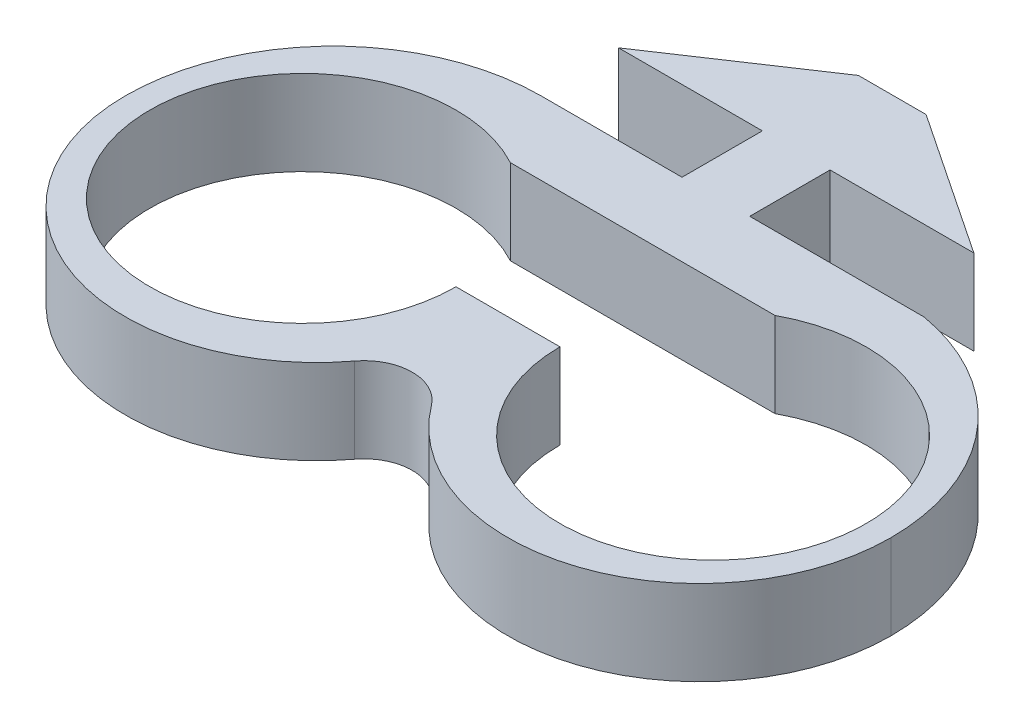
ISO-10303-21;
HEADER;
FILE_DESCRIPTION(('STEP AP214'),'2;1');
FILE_NAME('part.step','',(''),(''),'','','');
FILE_SCHEMA(('AUTOMOTIVE_DESIGN { 1 0 10303 214 1 1 1 1 }'));
ENDSEC;
DATA;
#1=APPLICATION_CONTEXT('core data for automotive mechanical design processes');
#2=APPLICATION_PROTOCOL_DEFINITION('international standard','automotive_design',2000,#1);
#3=PRODUCT_CONTEXT('',#1,'mechanical');
#4=PRODUCT('Part','Part','',(#3));
#5=PRODUCT_RELATED_PRODUCT_CATEGORY('part','',(#4));
#6=PRODUCT_DEFINITION_FORMATION('','',#4);
#7=PRODUCT_DEFINITION_CONTEXT('part definition',#1,'design');
#8=PRODUCT_DEFINITION('design','',#6,#7);
#9=PRODUCT_DEFINITION_SHAPE('','',#8);
#10=(LENGTH_UNIT() NAMED_UNIT(*) SI_UNIT(.MILLI.,.METRE.));
#11=(NAMED_UNIT(*) PLANE_ANGLE_UNIT() SI_UNIT($,.RADIAN.));
#12=(NAMED_UNIT(*) SI_UNIT($,.STERADIAN.) SOLID_ANGLE_UNIT());
#13=UNCERTAINTY_MEASURE_WITH_UNIT(LENGTH_MEASURE(1.E-05),#10,'distance_accuracy_value','');
#14=(GEOMETRIC_REPRESENTATION_CONTEXT(3) GLOBAL_UNCERTAINTY_ASSIGNED_CONTEXT((#13)) GLOBAL_UNIT_ASSIGNED_CONTEXT((#10,
#11,#12)) REPRESENTATION_CONTEXT('',''));
#15=CARTESIAN_POINT('',(0.,0.,0.));
#16=DIRECTION('',(0.,0.,1.));
#17=DIRECTION('',(1.,0.,0.));
#18=AXIS2_PLACEMENT_3D('',#15,#16,#17);
#19=CARTESIAN_POINT('',(0.,4.5,2.125));
#20=DIRECTION('',(0.,0.,1.));
#21=DIRECTION('',(1.,0.,0.));
#22=AXIS2_PLACEMENT_3D('',#19,#20,#21);
#23=PLANE('',#22);
#24=DIRECTION('',(0.,1.,0.));
#25=VECTOR('',#24,1.);
#26=CARTESIAN_POINT('',(-9.2518,-0.00100000000001401,2.125));
#27=LINE('',#26,#25);
#28=CARTESIAN_POINT('',(-9.2518,0.,2.125));
#29=VERTEX_POINT('',#28);
#30=CARTESIAN_POINT('',(-9.2518,4.5,2.125));
#31=VERTEX_POINT('',#30);
#32=EDGE_CURVE('E171',#29,#31,#27,.T.);
#33=ORIENTED_EDGE('',*,*,#32,.T.);
#34=DIRECTION('',(-1.,0.,0.));
#35=VECTOR('',#34,1.);
#36=CARTESIAN_POINT('',(0.,4.5,2.125));
#37=LINE('',#36,#35);
#38=CARTESIAN_POINT('',(-1.7907,4.5,2.125));
#39=VERTEX_POINT('',#38);
#40=EDGE_CURVE('E214',#39,#31,#37,.T.);
#41=ORIENTED_EDGE('',*,*,#40,.F.);
#42=DIRECTION('',(0.,-1.,0.));
#43=VECTOR('',#42,1.);
#44=CARTESIAN_POINT('',(-1.7907,4.5,2.125));
#45=LINE('',#44,#43);
#46=CARTESIAN_POINT('',(-1.7907,0.,2.125));
#47=VERTEX_POINT('',#46);
#48=EDGE_CURVE('E197',#39,#47,#45,.T.);
#49=ORIENTED_EDGE('',*,*,#48,.T.);
#50=DIRECTION('',(-1.,0.,0.));
#51=VECTOR('',#50,1.);
#52=CARTESIAN_POINT('',(0.,0.,2.125));
#53=LINE('',#52,#51);
#54=EDGE_CURVE('E189',#47,#29,#53,.T.);
#55=ORIENTED_EDGE('',*,*,#54,.T.);
#56=EDGE_LOOP('',(#33,#41,#49,#55));
#57=FACE_BOUND('',#56,.T.);
#58=ADVANCED_FACE('F47',(#57),#23,.F.);
#59=CARTESIAN_POINT('',(0.,4.5,2.125));
#60=DIRECTION('',(0.,0.,-1.));
#61=DIRECTION('',(-1.,0.,0.));
#62=AXIS2_PLACEMENT_3D('',#59,#60,#61);
#63=PLANE('',#62);
#64=DIRECTION('',(0.,1.,0.));
#65=VECTOR('',#64,1.);
#66=CARTESIAN_POINT('',(11.02035,-0.00100000000001401,2.125));
#67=LINE('',#66,#65);
#68=CARTESIAN_POINT('',(11.02035,0.,2.125));
#69=VERTEX_POINT('',#68);
#70=CARTESIAN_POINT('',(11.02035,4.5,2.125));
#71=VERTEX_POINT('',#70);
#72=EDGE_CURVE('E195',#69,#71,#67,.T.);
#73=ORIENTED_EDGE('',*,*,#72,.F.);
#74=DIRECTION('',(1.,0.,0.));
#75=VECTOR('',#74,1.);
#76=CARTESIAN_POINT('',(0.,0.,2.125));
#77=LINE('',#76,#75);
#78=CARTESIAN_POINT('',(1.7907,0.,2.125));
#79=VERTEX_POINT('',#78);
#80=EDGE_CURVE('E248',#79,#69,#77,.T.);
#81=ORIENTED_EDGE('',*,*,#80,.F.);
#82=DIRECTION('',(0.,-1.,0.));
#83=VECTOR('',#82,1.);
#84=CARTESIAN_POINT('',(1.7907,4.5,2.125));
#85=LINE('',#84,#83);
#86=CARTESIAN_POINT('',(1.7907,4.5,2.125));
#87=VERTEX_POINT('',#86);
#88=EDGE_CURVE('E56',#87,#79,#85,.T.);
#89=ORIENTED_EDGE('',*,*,#88,.F.);
#90=DIRECTION('',(1.,0.,0.));
#91=VECTOR('',#90,1.);
#92=CARTESIAN_POINT('',(0.,4.5,2.125));
#93=LINE('',#92,#91);
#94=EDGE_CURVE('E199',#87,#71,#93,.T.);
#95=ORIENTED_EDGE('',*,*,#94,.T.);
#96=EDGE_LOOP('',(#73,#81,#89,#95));
#97=FACE_BOUND('',#96,.T.);
#98=ADVANCED_FACE('F49',(#97),#63,.T.);
#99=CARTESIAN_POINT('',(1.7907,4.5,0.));
#100=DIRECTION('',(-1.,0.,0.));
#101=DIRECTION('',(0.,0.,1.));
#102=AXIS2_PLACEMENT_3D('',#99,#100,#101);
#103=PLANE('',#102);
#104=DIRECTION('',(0.,0.,-1.));
#105=VECTOR('',#104,1.);
#106=CARTESIAN_POINT('',(1.7907,0.,0.));
#107=LINE('',#106,#105);
#108=CARTESIAN_POINT('',(1.7907,0.,-2.125));
#109=VERTEX_POINT('',#108);
#110=EDGE_CURVE('E241',#79,#109,#107,.T.);
#111=ORIENTED_EDGE('',*,*,#110,.T.);
#112=DIRECTION('',(0.,-1.,0.));
#113=VECTOR('',#112,1.);
#114=CARTESIAN_POINT('',(1.7907,4.5,-2.125));
#115=LINE('',#114,#113);
#116=CARTESIAN_POINT('',(1.7907,4.5,-2.125));
#117=VERTEX_POINT('',#116);
#118=EDGE_CURVE('E232',#117,#109,#115,.T.);
#119=ORIENTED_EDGE('',*,*,#118,.F.);
#120=DIRECTION('',(0.,0.,-1.));
#121=VECTOR('',#120,1.);
#122=CARTESIAN_POINT('',(1.7907,4.5,0.));
#123=LINE('',#122,#121);
#124=EDGE_CURVE('E205',#87,#117,#123,.T.);
#125=ORIENTED_EDGE('',*,*,#124,.F.);
#126=ORIENTED_EDGE('',*,*,#88,.T.);
#127=EDGE_LOOP('',(#111,#119,#125,#126));
#128=FACE_BOUND('',#127,.T.);
#129=ADVANCED_FACE('F239',(#128),#103,.F.);
#130=CARTESIAN_POINT('',(0.,4.5,-2.125));
#131=DIRECTION('',(0.,0.,1.));
#132=DIRECTION('',(1.,0.,0.));
#133=AXIS2_PLACEMENT_3D('',#130,#131,#132);
#134=PLANE('',#133);
#135=DIRECTION('',(-1.,0.,0.));
#136=VECTOR('',#135,1.);
#137=CARTESIAN_POINT('',(0.,0.,-2.125));
#138=LINE('',#137,#136);
#139=CARTESIAN_POINT('',(9.398,0.,-2.125));
#140=VERTEX_POINT('',#139);
#141=EDGE_CURVE('E251',#140,#109,#138,.T.);
#142=ORIENTED_EDGE('',*,*,#141,.F.);
#143=DIRECTION('',(0.,-1.,0.));
#144=VECTOR('',#143,1.);
#145=CARTESIAN_POINT('',(9.398,4.5,-2.125));
#146=LINE('',#145,#144);
#147=CARTESIAN_POINT('',(9.398,4.5,-2.125));
#148=VERTEX_POINT('',#147);
#149=EDGE_CURVE('E229',#148,#140,#146,.T.);
#150=ORIENTED_EDGE('',*,*,#149,.F.);
#151=DIRECTION('',(-1.,0.,0.));
#152=VECTOR('',#151,1.);
#153=CARTESIAN_POINT('',(0.,4.5,-2.125));
#154=LINE('',#153,#152);
#155=EDGE_CURVE('E305',#148,#117,#154,.T.);
#156=ORIENTED_EDGE('',*,*,#155,.T.);
#157=ORIENTED_EDGE('',*,*,#118,.T.);
#158=EDGE_LOOP('',(#142,#150,#156,#157));
#159=FACE_BOUND('',#158,.T.);
#160=ADVANCED_FACE('F304',(#159),#134,.T.);
#161=CARTESIAN_POINT('',(3.87977278378415,4.5,-5.80995974371676));
#162=DIRECTION('',(0.555340809590661,0.,-0.831622862362014));
#163=DIRECTION('',(-0.831622862362014,0.,-0.555340809590661));
#164=AXIS2_PLACEMENT_3D('',#161,#162,#163);
#165=PLANE('',#164);
#166=DIRECTION('',(0.831622862362014,0.,0.555340809590661));
#167=VECTOR('',#166,1.);
#168=CARTESIAN_POINT('',(3.87977278378415,0.,-5.80995974371676));
#169=LINE('',#168,#167);
#170=CARTESIAN_POINT('',(1.7907,0.,-7.205));
#171=VERTEX_POINT('',#170);
#172=EDGE_CURVE('E266',#171,#140,#169,.T.);
#173=ORIENTED_EDGE('',*,*,#172,.F.);
#174=DIRECTION('',(0.,-1.,0.));
#175=VECTOR('',#174,1.);
#176=CARTESIAN_POINT('',(1.7907,4.5,-7.205));
#177=LINE('',#176,#175);
#178=CARTESIAN_POINT('',(1.7907,4.5,-7.205));
#179=VERTEX_POINT('',#178);
#180=EDGE_CURVE('E226',#179,#171,#177,.T.);
#181=ORIENTED_EDGE('',*,*,#180,.F.);
#182=DIRECTION('',(0.831622862362014,0.,0.555340809590661));
#183=VECTOR('',#182,1.);
#184=CARTESIAN_POINT('',(3.87977278378415,4.5,-5.80995974371676));
#185=LINE('',#184,#183);
#186=EDGE_CURVE('E300',#179,#148,#185,.T.);
#187=ORIENTED_EDGE('',*,*,#186,.T.);
#188=ORIENTED_EDGE('',*,*,#149,.T.);
#189=EDGE_LOOP('',(#173,#181,#187,#188));
#190=FACE_BOUND('',#189,.T.);
#191=ADVANCED_FACE('F297',(#190),#165,.T.);
#192=CARTESIAN_POINT('',(0.,4.5,-7.205));
#193=DIRECTION('',(0.,0.,-1.));
#194=DIRECTION('',(-1.,0.,0.));
#195=AXIS2_PLACEMENT_3D('',#192,#193,#194);
#196=PLANE('',#195);
#197=DIRECTION('',(1.,0.,0.));
#198=VECTOR('',#197,1.);
#199=CARTESIAN_POINT('',(0.,0.,-7.205));
#200=LINE('',#199,#198);
#201=CARTESIAN_POINT('',(-1.7907,0.,-7.205));
#202=VERTEX_POINT('',#201);
#203=EDGE_CURVE('E269',#202,#171,#200,.T.);
#204=ORIENTED_EDGE('',*,*,#203,.F.);
#205=DIRECTION('',(0.,-1.,0.));
#206=VECTOR('',#205,1.);
#207=CARTESIAN_POINT('',(-1.7907,4.5,-7.205));
#208=LINE('',#207,#206);
#209=CARTESIAN_POINT('',(-1.7907,4.5,-7.205));
#210=VERTEX_POINT('',#209);
#211=EDGE_CURVE('E223',#210,#202,#208,.T.);
#212=ORIENTED_EDGE('',*,*,#211,.F.);
#213=DIRECTION('',(1.,0.,0.));
#214=VECTOR('',#213,1.);
#215=CARTESIAN_POINT('',(0.,4.5,-7.205));
#216=LINE('',#215,#214);
#217=EDGE_CURVE('E311',#210,#179,#216,.T.);
#218=ORIENTED_EDGE('',*,*,#217,.T.);
#219=ORIENTED_EDGE('',*,*,#180,.T.);
#220=EDGE_LOOP('',(#204,#212,#218,#219));
#221=FACE_BOUND('',#220,.T.);
#222=ADVANCED_FACE('F294',(#221),#196,.T.);
#223=CARTESIAN_POINT('',(-3.87977278378415,4.5,-5.80995974371676));
#224=DIRECTION('',(-0.555340809590661,0.,-0.831622862362014));
#225=DIRECTION('',(-0.831622862362014,0.,0.555340809590661));
#226=AXIS2_PLACEMENT_3D('',#223,#224,#225);
#227=PLANE('',#226);
#228=DIRECTION('',(0.831622862362014,0.,-0.555340809590661));
#229=VECTOR('',#228,1.);
#230=CARTESIAN_POINT('',(-3.87977278378415,0.,-5.80995974371676));
#231=LINE('',#230,#229);
#232=CARTESIAN_POINT('',(-9.398,0.,-2.125));
#233=VERTEX_POINT('',#232);
#234=EDGE_CURVE('E273',#233,#202,#231,.T.);
#235=ORIENTED_EDGE('',*,*,#234,.F.);
#236=DIRECTION('',(0.,-1.,0.));
#237=VECTOR('',#236,1.);
#238=CARTESIAN_POINT('',(-9.398,4.5,-2.125));
#239=LINE('',#238,#237);
#240=CARTESIAN_POINT('',(-9.398,4.5,-2.125));
#241=VERTEX_POINT('',#240);
#242=EDGE_CURVE('E220',#241,#233,#239,.T.);
#243=ORIENTED_EDGE('',*,*,#242,.F.);
#244=DIRECTION('',(0.831622862362014,0.,-0.555340809590661));
#245=VECTOR('',#244,1.);
#246=CARTESIAN_POINT('',(-3.87977278378415,4.5,-5.80995974371676));
#247=LINE('',#246,#245);
#248=EDGE_CURVE('E290',#241,#210,#247,.T.);
#249=ORIENTED_EDGE('',*,*,#248,.T.);
#250=ORIENTED_EDGE('',*,*,#211,.T.);
#251=EDGE_LOOP('',(#235,#243,#249,#250));
#252=FACE_BOUND('',#251,.T.);
#253=ADVANCED_FACE('F288',(#252),#227,.T.);
#254=CARTESIAN_POINT('',(0.,4.5,-2.125));
#255=DIRECTION('',(0.,0.,1.));
#256=DIRECTION('',(1.,0.,0.));
#257=AXIS2_PLACEMENT_3D('',#254,#255,#256);
#258=PLANE('',#257);
#259=DIRECTION('',(-1.,0.,0.));
#260=VECTOR('',#259,1.);
#261=CARTESIAN_POINT('',(0.,0.,-2.125));
#262=LINE('',#261,#260);
#263=CARTESIAN_POINT('',(-1.7907,0.,-2.125));
#264=VERTEX_POINT('',#263);
#265=EDGE_CURVE('E207',#264,#233,#262,.T.);
#266=ORIENTED_EDGE('',*,*,#265,.F.);
#267=DIRECTION('',(0.,-1.,0.));
#268=VECTOR('',#267,1.);
#269=CARTESIAN_POINT('',(-1.7907,4.5,-2.125));
#270=LINE('',#269,#268);
#271=CARTESIAN_POINT('',(-1.7907,4.5,-2.125));
#272=VERTEX_POINT('',#271);
#273=EDGE_CURVE('E217',#272,#264,#270,.T.);
#274=ORIENTED_EDGE('',*,*,#273,.F.);
#275=DIRECTION('',(-1.,0.,0.));
#276=VECTOR('',#275,1.);
#277=CARTESIAN_POINT('',(0.,4.5,-2.125));
#278=LINE('',#277,#276);
#279=EDGE_CURVE('E284',#272,#241,#278,.T.);
#280=ORIENTED_EDGE('',*,*,#279,.T.);
#281=ORIENTED_EDGE('',*,*,#242,.T.);
#282=EDGE_LOOP('',(#266,#274,#280,#281));
#283=FACE_BOUND('',#282,.T.);
#284=ADVANCED_FACE('F281',(#283),#258,.T.);
#285=CARTESIAN_POINT('',(-1.7907,4.5,0.));
#286=DIRECTION('',(-1.,0.,0.));
#287=DIRECTION('',(0.,0.,1.));
#288=AXIS2_PLACEMENT_3D('',#285,#286,#287);
#289=PLANE('',#288);
#290=DIRECTION('',(0.,0.,-1.));
#291=VECTOR('',#290,1.);
#292=CARTESIAN_POINT('',(-1.7907,0.,0.));
#293=LINE('',#292,#291);
#294=EDGE_CURVE('E200',#47,#264,#293,.T.);
#295=ORIENTED_EDGE('',*,*,#294,.F.);
#296=ORIENTED_EDGE('',*,*,#48,.F.);
#297=DIRECTION('',(0.,0.,-1.));
#298=VECTOR('',#297,1.);
#299=CARTESIAN_POINT('',(-1.7907,4.5,0.));
#300=LINE('',#299,#298);
#301=EDGE_CURVE('E320',#39,#272,#300,.T.);
#302=ORIENTED_EDGE('',*,*,#301,.T.);
#303=ORIENTED_EDGE('',*,*,#273,.T.);
#304=EDGE_LOOP('',(#295,#296,#302,#303));
#305=FACE_BOUND('',#304,.T.);
#306=ADVANCED_FACE('F439',(#305),#289,.T.);
#307=CARTESIAN_POINT('',(0.,4.5,0.));
#308=DIRECTION('',(0.,1.,0.));
#309=DIRECTION('',(0.,0.,1.));
#310=AXIS2_PLACEMENT_3D('',#307,#308,#309);
#311=PLANE('',#310);
#312=CARTESIAN_POINT('',(-9.2518,4.5,13.1232));
#313=DIRECTION('',(0.,-1.,0.));
#314=DIRECTION('',(0.,0.,1.));
#315=AXIS2_PLACEMENT_3D('',#312,#313,#314);
#316=CIRCLE('',#315,10.9982);
#317=CARTESIAN_POINT('',(-20.25,4.5,13.1232));
#318=VERTEX_POINT('',#317);
#319=EDGE_CURVE('E177',#318,#31,#316,.T.);
#320=ORIENTED_EDGE('',*,*,#319,.F.);
#321=CARTESIAN_POINT('',(-10.125,4.5,13.1232));
#322=DIRECTION('',(0.,1.,0.));
#323=DIRECTION('',(0.,0.,1.));
#324=AXIS2_PLACEMENT_3D('',#321,#322,#323);
#325=CIRCLE('',#324,10.125);
#326=CARTESIAN_POINT('',(-2.03059613106988,4.5,19.2056543571365));
#327=VERTEX_POINT('',#326);
#328=EDGE_CURVE('E331',#318,#327,#325,.T.);
#329=ORIENTED_EDGE('',*,*,#328,.T.);
#330=CARTESIAN_POINT('',(0.,4.5,20.7315243884577));
#331=DIRECTION('',(0.,1.,0.));
#332=DIRECTION('',(0.,0.,1.));
#333=AXIS2_PLACEMENT_3D('',#330,#331,#332);
#334=CIRCLE('',#333,2.54);
#335=CARTESIAN_POINT('',(2.03059613106987,4.5,19.2056543571365));
#336=VERTEX_POINT('',#335);
#337=EDGE_CURVE('E347',#336,#327,#334,.T.);
#338=ORIENTED_EDGE('',*,*,#337,.F.);
#339=CARTESIAN_POINT('',(10.125,4.5,13.1232));
#340=DIRECTION('',(0.,1.,0.));
#341=DIRECTION('',(0.,0.,1.));
#342=AXIS2_PLACEMENT_3D('',#339,#340,#341);
#343=CIRCLE('',#342,10.125);
#344=CARTESIAN_POINT('',(20.25,4.5,13.1232));
#345=VERTEX_POINT('',#344);
#346=EDGE_CURVE('E341',#336,#345,#343,.T.);
#347=ORIENTED_EDGE('',*,*,#346,.T.);
#348=CARTESIAN_POINT('',(9.0823586288483,4.5,13.1232));
#349=DIRECTION('',(0.,-1.,0.));
#350=DIRECTION('',(0.,0.,1.));
#351=AXIS2_PLACEMENT_3D('',#348,#349,#350);
#352=CIRCLE('',#351,11.1676413711517);
#353=EDGE_CURVE('E408',#71,#345,#352,.T.);
#354=ORIENTED_EDGE('',*,*,#353,.F.);
#355=ORIENTED_EDGE('',*,*,#94,.F.);
#356=ORIENTED_EDGE('',*,*,#124,.T.);
#357=ORIENTED_EDGE('',*,*,#155,.F.);
#358=ORIENTED_EDGE('',*,*,#186,.F.);
#359=ORIENTED_EDGE('',*,*,#217,.F.);
#360=ORIENTED_EDGE('',*,*,#248,.F.);
#361=ORIENTED_EDGE('',*,*,#279,.F.);
#362=ORIENTED_EDGE('',*,*,#301,.F.);
#363=ORIENTED_EDGE('',*,*,#40,.T.);
#364=EDGE_LOOP('',(#320,#329,#338,#347,#354,#355,#356,#357,#358,#359,#360,#361,#362,#363));
#365=FACE_BOUND('',#364,.T.);
#366=DIRECTION('',(1.,0.,0.));
#367=VECTOR('',#366,1.);
#368=CARTESIAN_POINT('',(-2.75,4.5,13.1232));
#369=LINE('',#368,#367);
#370=CARTESIAN_POINT('',(-2.75,4.5,13.1232));
#371=VERTEX_POINT('',#370);
#372=CARTESIAN_POINT('',(2.75000000000001,4.5,13.1232));
#373=VERTEX_POINT('',#372);
#374=EDGE_CURVE('E399',#371,#373,#369,.T.);
#375=ORIENTED_EDGE('',*,*,#374,.F.);
#376=CARTESIAN_POINT('',(-10.85,4.5,13.1232));
#377=DIRECTION('',(0.,1.,0.));
#378=DIRECTION('',(0.,0.,1.));
#379=AXIS2_PLACEMENT_3D('',#376,#377,#378);
#380=CIRCLE('',#379,8.1);
#381=CARTESIAN_POINT('',(-6.99999999999999,4.5,5.99666507761314));
#382=VERTEX_POINT('',#381);
#383=EDGE_CURVE('E365',#382,#371,#380,.T.);
#384=ORIENTED_EDGE('',*,*,#383,.F.);
#385=DIRECTION('',(-1.,0.,0.));
#386=VECTOR('',#385,1.);
#387=CARTESIAN_POINT('',(7.00000000000001,4.5,5.99666507761314));
#388=LINE('',#387,#386);
#389=CARTESIAN_POINT('',(7.00000000000001,4.5,5.99666507761314));
#390=VERTEX_POINT('',#389);
#391=EDGE_CURVE('E63',#390,#382,#388,.T.);
#392=ORIENTED_EDGE('',*,*,#391,.F.);
#393=CARTESIAN_POINT('',(10.85,4.5,13.1232));
#394=DIRECTION('',(0.,1.,0.));
#395=DIRECTION('',(0.,0.,1.));
#396=AXIS2_PLACEMENT_3D('',#393,#394,#395);
#397=CIRCLE('',#396,8.09999999999999);
#398=EDGE_CURVE('E358',#373,#390,#397,.T.);
#399=ORIENTED_EDGE('',*,*,#398,.F.);
#400=EDGE_LOOP('',(#375,#384,#392,#399));
#401=FACE_BOUND('',#400,.T.);
#402=ADVANCED_FACE('F326',(#365,#401),#311,.T.);
#403=CARTESIAN_POINT('',(0.,0.,0.));
#404=DIRECTION('',(0.,1.,0.));
#405=DIRECTION('',(0.,0.,1.));
#406=AXIS2_PLACEMENT_3D('',#403,#404,#405);
#407=PLANE('',#406);
#408=CARTESIAN_POINT('',(-10.85,0.,13.1232));
#409=DIRECTION('',(0.,1.,0.));
#410=DIRECTION('',(0.,0.,1.));
#411=AXIS2_PLACEMENT_3D('',#408,#409,#410);
#412=CIRCLE('',#411,8.1);
#413=CARTESIAN_POINT('',(-6.99999999999999,0.,5.99666507761314));
#414=VERTEX_POINT('',#413);
#415=CARTESIAN_POINT('',(-2.75,0.,13.1232));
#416=VERTEX_POINT('',#415);
#417=EDGE_CURVE('E361',#414,#416,#412,.T.);
#418=ORIENTED_EDGE('',*,*,#417,.T.);
#419=DIRECTION('',(-1.,0.,0.));
#420=VECTOR('',#419,1.);
#421=CARTESIAN_POINT('',(-2.75,0.,13.1232));
#422=LINE('',#421,#420);
#423=CARTESIAN_POINT('',(2.75000000000001,0.,13.1232));
#424=VERTEX_POINT('',#423);
#425=EDGE_CURVE('E71',#424,#416,#422,.T.);
#426=ORIENTED_EDGE('',*,*,#425,.F.);
#427=CARTESIAN_POINT('',(10.85,0.,13.1232));
#428=DIRECTION('',(0.,1.,0.));
#429=DIRECTION('',(0.,0.,1.));
#430=AXIS2_PLACEMENT_3D('',#427,#428,#429);
#431=CIRCLE('',#430,8.09999999999999);
#432=CARTESIAN_POINT('',(7.00000000000001,0.,5.99666507761314));
#433=VERTEX_POINT('',#432);
#434=EDGE_CURVE('E372',#424,#433,#431,.T.);
#435=ORIENTED_EDGE('',*,*,#434,.T.);
#436=DIRECTION('',(1.,0.,0.));
#437=VECTOR('',#436,1.);
#438=CARTESIAN_POINT('',(7.00000000000001,0.,5.99666507761314));
#439=LINE('',#438,#437);
#440=EDGE_CURVE('E183',#414,#433,#439,.T.);
#441=ORIENTED_EDGE('',*,*,#440,.F.);
#442=EDGE_LOOP('',(#418,#426,#435,#441));
#443=FACE_BOUND('',#442,.T.);
#444=CARTESIAN_POINT('',(-10.125,0.,13.1232));
#445=DIRECTION('',(0.,1.,0.));
#446=DIRECTION('',(0.,0.,1.));
#447=AXIS2_PLACEMENT_3D('',#444,#445,#446);
#448=CIRCLE('',#447,10.125);
#449=CARTESIAN_POINT('',(-2.03059613106988,0.,19.2056543571365));
#450=VERTEX_POINT('',#449);
#451=CARTESIAN_POINT('',(-20.25,0.,13.1232));
#452=VERTEX_POINT('',#451);
#453=EDGE_CURVE('E192',#450,#452,#448,.F.);
#454=ORIENTED_EDGE('',*,*,#453,.T.);
#455=CARTESIAN_POINT('',(-9.2518,0.,13.1232));
#456=DIRECTION('',(0.,1.,0.));
#457=DIRECTION('',(0.,0.,1.));
#458=AXIS2_PLACEMENT_3D('',#455,#456,#457);
#459=CIRCLE('',#458,10.9982);
#460=EDGE_CURVE('E174',#29,#452,#459,.T.);
#461=ORIENTED_EDGE('',*,*,#460,.F.);
#462=ORIENTED_EDGE('',*,*,#54,.F.);
#463=ORIENTED_EDGE('',*,*,#294,.T.);
#464=ORIENTED_EDGE('',*,*,#265,.T.);
#465=ORIENTED_EDGE('',*,*,#234,.T.);
#466=ORIENTED_EDGE('',*,*,#203,.T.);
#467=ORIENTED_EDGE('',*,*,#172,.T.);
#468=ORIENTED_EDGE('',*,*,#141,.T.);
#469=ORIENTED_EDGE('',*,*,#110,.F.);
#470=ORIENTED_EDGE('',*,*,#80,.T.);
#471=CARTESIAN_POINT('',(9.0823586288483,0.,13.1232));
#472=DIRECTION('',(0.,1.,0.));
#473=DIRECTION('',(0.,0.,1.));
#474=AXIS2_PLACEMENT_3D('',#471,#472,#473);
#475=CIRCLE('',#474,11.1676413711517);
#476=CARTESIAN_POINT('',(20.25,0.,13.1232));
#477=VERTEX_POINT('',#476);
#478=EDGE_CURVE('E411',#477,#69,#475,.T.);
#479=ORIENTED_EDGE('',*,*,#478,.F.);
#480=CARTESIAN_POINT('',(10.125,0.,13.1232));
#481=DIRECTION('',(0.,1.,0.));
#482=DIRECTION('',(0.,0.,1.));
#483=AXIS2_PLACEMENT_3D('',#480,#481,#482);
#484=CIRCLE('',#483,10.125);
#485=CARTESIAN_POINT('',(2.03059613106987,0.,19.2056543571365));
#486=VERTEX_POINT('',#485);
#487=EDGE_CURVE('E256',#477,#486,#484,.F.);
#488=ORIENTED_EDGE('',*,*,#487,.T.);
#489=CARTESIAN_POINT('',(0.,0.,20.7315243884577));
#490=DIRECTION('',(0.,1.,0.));
#491=DIRECTION('',(0.,0.,1.));
#492=AXIS2_PLACEMENT_3D('',#489,#490,#491);
#493=CIRCLE('',#492,2.54);
#494=EDGE_CURVE('E259',#450,#486,#493,.F.);
#495=ORIENTED_EDGE('',*,*,#494,.F.);
#496=EDGE_LOOP('',(#454,#461,#462,#463,#464,#465,#466,#467,#468,#469,#470,#479,#488,#495));
#497=FACE_BOUND('',#496,.T.);
#498=ADVANCED_FACE('F187',(#443,#497),#407,.F.);
#499=CARTESIAN_POINT('',(0.,-41.7464444593788,20.7315243884577));
#500=DIRECTION('',(0.,1.,0.));
#501=DIRECTION('',(0.,0.,1.));
#502=AXIS2_PLACEMENT_3D('',#499,#500,#501);
#503=CYLINDRICAL_SURFACE('',#502,2.54);
#504=DIRECTION('',(0.,1.,0.));
#505=VECTOR('',#504,1.);
#506=CARTESIAN_POINT('',(-2.03059613106988,-41.7464444593788,19.2056543571365));
#507=LINE('',#506,#505);
#508=EDGE_CURVE('E337',#450,#327,#507,.T.);
#509=ORIENTED_EDGE('',*,*,#508,.F.);
#510=ORIENTED_EDGE('',*,*,#494,.T.);
#511=DIRECTION('',(0.,1.,0.));
#512=VECTOR('',#511,1.);
#513=CARTESIAN_POINT('',(2.03059613106987,-41.7464444593788,19.2056543571365));
#514=LINE('',#513,#512);
#515=EDGE_CURVE('E340',#486,#336,#514,.T.);
#516=ORIENTED_EDGE('',*,*,#515,.T.);
#517=ORIENTED_EDGE('',*,*,#337,.T.);
#518=EDGE_LOOP('',(#509,#510,#516,#517));
#519=FACE_BOUND('',#518,.T.);
#520=ADVANCED_FACE('F422',(#519),#503,.F.);
#521=CARTESIAN_POINT('',(-10.125,-41.7464444593788,13.1232));
#522=DIRECTION('',(0.,1.,0.));
#523=DIRECTION('',(0.,0.,1.));
#524=AXIS2_PLACEMENT_3D('',#521,#522,#523);
#525=CYLINDRICAL_SURFACE('',#524,10.125);
#526=ORIENTED_EDGE('',*,*,#453,.F.);
#527=ORIENTED_EDGE('',*,*,#508,.T.);
#528=ORIENTED_EDGE('',*,*,#328,.F.);
#529=DIRECTION('',(0.,-1.,0.));
#530=VECTOR('',#529,1.);
#531=CARTESIAN_POINT('',(-20.25,4.5,13.1232));
#532=LINE('',#531,#530);
#533=EDGE_CURVE('E211',#318,#452,#532,.T.);
#534=ORIENTED_EDGE('',*,*,#533,.T.);
#535=EDGE_LOOP('',(#526,#527,#528,#534));
#536=FACE_BOUND('',#535,.T.);
#537=ADVANCED_FACE('F335',(#536),#525,.T.);
#538=CARTESIAN_POINT('',(10.125,-41.7464444593788,13.1232));
#539=DIRECTION('',(0.,1.,0.));
#540=DIRECTION('',(0.,0.,1.));
#541=AXIS2_PLACEMENT_3D('',#538,#539,#540);
#542=CYLINDRICAL_SURFACE('',#541,10.125);
#543=ORIENTED_EDGE('',*,*,#487,.F.);
#544=DIRECTION('',(0.,-1.,0.));
#545=VECTOR('',#544,1.);
#546=CARTESIAN_POINT('',(20.25,4.5,13.1232));
#547=LINE('',#546,#545);
#548=EDGE_CURVE('E11',#345,#477,#547,.T.);
#549=ORIENTED_EDGE('',*,*,#548,.F.);
#550=ORIENTED_EDGE('',*,*,#346,.F.);
#551=ORIENTED_EDGE('',*,*,#515,.F.);
#552=EDGE_LOOP('',(#543,#549,#550,#551));
#553=FACE_BOUND('',#552,.T.);
#554=ADVANCED_FACE('F420',(#553),#542,.T.);
#555=CARTESIAN_POINT('',(10.85,0.,13.1232));
#556=DIRECTION('',(0.,1.,0.));
#557=DIRECTION('',(0.,0.,1.));
#558=AXIS2_PLACEMENT_3D('',#555,#556,#557);
#559=CYLINDRICAL_SURFACE('',#558,8.09999999999999);
#560=ORIENTED_EDGE('',*,*,#434,.F.);
#561=DIRECTION('',(0.,1.,0.));
#562=VECTOR('',#561,1.);
#563=CARTESIAN_POINT('',(2.75000000000001,-0.00100000000001401,13.1232));
#564=LINE('',#563,#562);
#565=EDGE_CURVE('E375',#424,#373,#564,.T.);
#566=ORIENTED_EDGE('',*,*,#565,.T.);
#567=ORIENTED_EDGE('',*,*,#398,.T.);
#568=DIRECTION('',(0.,1.,0.));
#569=VECTOR('',#568,1.);
#570=CARTESIAN_POINT('',(7.00000000000001,-0.00100000000001401,5.99666507761314));
#571=LINE('',#570,#569);
#572=EDGE_CURVE('E392',#433,#390,#571,.T.);
#573=ORIENTED_EDGE('',*,*,#572,.F.);
#574=EDGE_LOOP('',(#560,#566,#567,#573));
#575=FACE_BOUND('',#574,.T.);
#576=ADVANCED_FACE('F509',(#575),#559,.F.);
#577=CARTESIAN_POINT('',(-10.85,0.,13.1232));
#578=DIRECTION('',(0.,1.,0.));
#579=DIRECTION('',(0.,0.,1.));
#580=AXIS2_PLACEMENT_3D('',#577,#578,#579);
#581=CYLINDRICAL_SURFACE('',#580,8.1);
#582=ORIENTED_EDGE('',*,*,#383,.T.);
#583=DIRECTION('',(0.,1.,0.));
#584=VECTOR('',#583,1.);
#585=CARTESIAN_POINT('',(-2.75,-0.00100000000001401,13.1232));
#586=LINE('',#585,#584);
#587=EDGE_CURVE('E382',#416,#371,#586,.T.);
#588=ORIENTED_EDGE('',*,*,#587,.F.);
#589=ORIENTED_EDGE('',*,*,#417,.F.);
#590=DIRECTION('',(0.,1.,0.));
#591=VECTOR('',#590,1.);
#592=CARTESIAN_POINT('',(-6.99999999999999,-0.00100000000001401,5.99666507761314));
#593=LINE('',#592,#591);
#594=EDGE_CURVE('E388',#414,#382,#593,.T.);
#595=ORIENTED_EDGE('',*,*,#594,.T.);
#596=EDGE_LOOP('',(#582,#588,#589,#595));
#597=FACE_BOUND('',#596,.T.);
#598=ADVANCED_FACE('F517',(#597),#581,.F.);
#599=CARTESIAN_POINT('',(7.00000000000001,-0.00100000000001401,5.99666507761314));
#600=DIRECTION('',(0.,0.,-1.));
#601=DIRECTION('',(-1.,0.,0.));
#602=AXIS2_PLACEMENT_3D('',#599,#600,#601);
#603=PLANE('',#602);
#604=ORIENTED_EDGE('',*,*,#440,.T.);
#605=ORIENTED_EDGE('',*,*,#572,.T.);
#606=ORIENTED_EDGE('',*,*,#391,.T.);
#607=ORIENTED_EDGE('',*,*,#594,.F.);
#608=EDGE_LOOP('',(#604,#605,#606,#607));
#609=FACE_BOUND('',#608,.T.);
#610=ADVANCED_FACE('F526',(#609),#603,.F.);
#611=CARTESIAN_POINT('',(-2.75,-0.00100000000001401,13.1232));
#612=DIRECTION('',(0.,0.,1.));
#613=DIRECTION('',(1.,0.,0.));
#614=AXIS2_PLACEMENT_3D('',#611,#612,#613);
#615=PLANE('',#614);
#616=ORIENTED_EDGE('',*,*,#425,.T.);
#617=ORIENTED_EDGE('',*,*,#587,.T.);
#618=ORIENTED_EDGE('',*,*,#374,.T.);
#619=ORIENTED_EDGE('',*,*,#565,.F.);
#620=EDGE_LOOP('',(#616,#617,#618,#619));
#621=FACE_BOUND('',#620,.T.);
#622=ADVANCED_FACE('F536',(#621),#615,.F.);
#623=CARTESIAN_POINT('',(9.0823586288483,-0.00100000000001401,13.1232));
#624=DIRECTION('',(0.,1.,0.));
#625=DIRECTION('',(0.,0.,1.));
#626=AXIS2_PLACEMENT_3D('',#623,#624,#625);
#627=CYLINDRICAL_SURFACE('',#626,11.1676413711517);
#628=ORIENTED_EDGE('',*,*,#478,.T.);
#629=ORIENTED_EDGE('',*,*,#72,.T.);
#630=ORIENTED_EDGE('',*,*,#353,.T.);
#631=ORIENTED_EDGE('',*,*,#548,.T.);
#632=EDGE_LOOP('',(#628,#629,#630,#631));
#633=FACE_BOUND('',#632,.T.);
#634=ADVANCED_FACE('F414',(#633),#627,.T.);
#635=CARTESIAN_POINT('',(-9.2518,-0.00100000000001401,13.1232));
#636=DIRECTION('',(0.,1.,0.));
#637=DIRECTION('',(0.,0.,1.));
#638=AXIS2_PLACEMENT_3D('',#635,#636,#637);
#639=CYLINDRICAL_SURFACE('',#638,10.9982);
#640=ORIENTED_EDGE('',*,*,#460,.T.);
#641=ORIENTED_EDGE('',*,*,#533,.F.);
#642=ORIENTED_EDGE('',*,*,#319,.T.);
#643=ORIENTED_EDGE('',*,*,#32,.F.);
#644=EDGE_LOOP('',(#640,#641,#642,#643));
#645=FACE_BOUND('',#644,.T.);
#646=ADVANCED_FACE('F173',(#645),#639,.T.);
#647=CLOSED_SHELL('',(#58,#98,#129,#160,#191,#222,#253,#284,#306,#402,#498,#520,#537,#554,#576,
#598,#610,#622,#634,#646));
#648=MANIFOLD_SOLID_BREP('B2',#647);
#649=ADVANCED_BREP_SHAPE_REPRESENTATION('',(#18,#648),#14);
#650=SHAPE_DEFINITION_REPRESENTATION(#9,#649);
ENDSEC;
END-ISO-10303-21;
